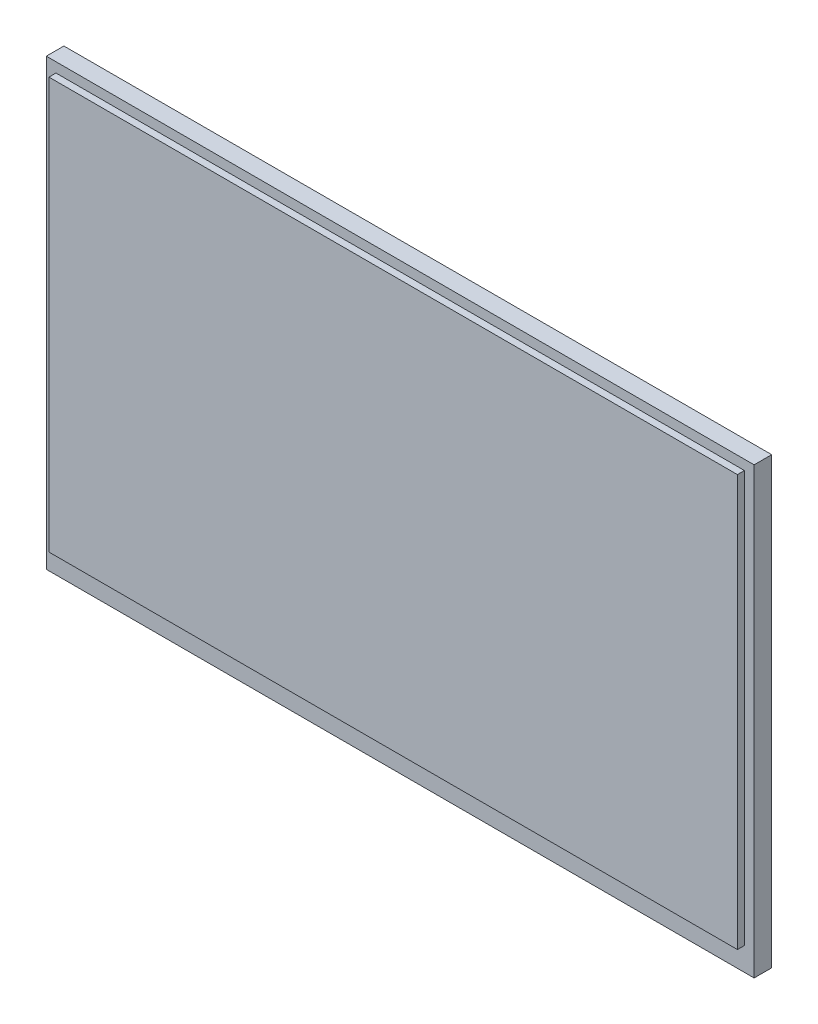
ISO-10303-21;
HEADER;
FILE_DESCRIPTION(('STEP AP214'),'2;1');
FILE_NAME('part.step','',(''),(''),'','','');
FILE_SCHEMA(('AUTOMOTIVE_DESIGN { 1 0 10303 214 1 1 1 1 }'));
ENDSEC;
DATA;
#1=APPLICATION_CONTEXT('core data for automotive mechanical design processes');
#2=APPLICATION_PROTOCOL_DEFINITION('international standard','automotive_design',2000,#1);
#3=PRODUCT_CONTEXT('',#1,'mechanical');
#4=PRODUCT('Part','Part','',(#3));
#5=PRODUCT_RELATED_PRODUCT_CATEGORY('part','',(#4));
#6=PRODUCT_DEFINITION_FORMATION('','',#4);
#7=PRODUCT_DEFINITION_CONTEXT('part definition',#1,'design');
#8=PRODUCT_DEFINITION('design','',#6,#7);
#9=PRODUCT_DEFINITION_SHAPE('','',#8);
#10=(LENGTH_UNIT() NAMED_UNIT(*) SI_UNIT(.MILLI.,.METRE.));
#11=(NAMED_UNIT(*) PLANE_ANGLE_UNIT() SI_UNIT($,.RADIAN.));
#12=(NAMED_UNIT(*) SI_UNIT($,.STERADIAN.) SOLID_ANGLE_UNIT());
#13=UNCERTAINTY_MEASURE_WITH_UNIT(LENGTH_MEASURE(1.E-05),#10,'distance_accuracy_value','');
#14=(GEOMETRIC_REPRESENTATION_CONTEXT(3) GLOBAL_UNCERTAINTY_ASSIGNED_CONTEXT((#13)) GLOBAL_UNIT_ASSIGNED_CONTEXT((#10,
#11,#12)) REPRESENTATION_CONTEXT('',''));
#15=CARTESIAN_POINT('',(0.,0.,0.));
#16=DIRECTION('',(0.,0.,1.));
#17=DIRECTION('',(1.,0.,0.));
#18=AXIS2_PLACEMENT_3D('',#15,#16,#17);
#19=CARTESIAN_POINT('',(60.4,37.925,3.));
#20=DIRECTION('',(-1.,0.,0.));
#21=DIRECTION('',(0.,0.,1.));
#22=AXIS2_PLACEMENT_3D('',#19,#20,#21);
#23=PLANE('',#22);
#24=DIRECTION('',(0.,1.,0.));
#25=VECTOR('',#24,1.);
#26=CARTESIAN_POINT('',(60.4,37.925,0.));
#27=LINE('',#26,#25);
#28=CARTESIAN_POINT('',(60.4,-37.925,0.));
#29=VERTEX_POINT('',#28);
#30=CARTESIAN_POINT('',(60.4,37.925,0.));
#31=VERTEX_POINT('',#30);
#32=EDGE_CURVE('E119',#29,#31,#27,.T.);
#33=ORIENTED_EDGE('',*,*,#32,.T.);
#34=DIRECTION('',(0.,0.,-1.));
#35=VECTOR('',#34,1.);
#36=CARTESIAN_POINT('',(60.4,37.925,3.));
#37=LINE('',#36,#35);
#38=CARTESIAN_POINT('',(60.4,37.925,3.));
#39=VERTEX_POINT('',#38);
#40=EDGE_CURVE('E11',#39,#31,#37,.T.);
#41=ORIENTED_EDGE('',*,*,#40,.F.);
#42=DIRECTION('',(0.,1.,0.));
#43=VECTOR('',#42,1.);
#44=CARTESIAN_POINT('',(60.4,37.925,3.));
#45=LINE('',#44,#43);
#46=CARTESIAN_POINT('',(60.4,-37.925,3.));
#47=VERTEX_POINT('',#46);
#48=EDGE_CURVE('E128',#47,#39,#45,.T.);
#49=ORIENTED_EDGE('',*,*,#48,.F.);
#50=DIRECTION('',(0.,0.,-1.));
#51=VECTOR('',#50,1.);
#52=CARTESIAN_POINT('',(60.4,-37.925,3.));
#53=LINE('',#52,#51);
#54=EDGE_CURVE('E137',#47,#29,#53,.T.);
#55=ORIENTED_EDGE('',*,*,#54,.T.);
#56=EDGE_LOOP('',(#33,#41,#49,#55));
#57=FACE_BOUND('',#56,.T.);
#58=ADVANCED_FACE('F35',(#57),#23,.F.);
#59=CARTESIAN_POINT('',(-60.4,37.925,3.));
#60=DIRECTION('',(0.,-1.,0.));
#61=DIRECTION('',(1.,0.,0.));
#62=AXIS2_PLACEMENT_3D('',#59,#60,#61);
#63=PLANE('',#62);
#64=DIRECTION('',(-1.,0.,0.));
#65=VECTOR('',#64,1.);
#66=CARTESIAN_POINT('',(-60.4,37.925,0.));
#67=LINE('',#66,#65);
#68=CARTESIAN_POINT('',(-60.4,37.925,0.));
#69=VERTEX_POINT('',#68);
#70=EDGE_CURVE('E122',#31,#69,#67,.T.);
#71=ORIENTED_EDGE('',*,*,#70,.T.);
#72=DIRECTION('',(0.,0.,-1.));
#73=VECTOR('',#72,1.);
#74=CARTESIAN_POINT('',(-60.4,37.925,3.));
#75=LINE('',#74,#73);
#76=CARTESIAN_POINT('',(-60.4,37.925,3.));
#77=VERTEX_POINT('',#76);
#78=EDGE_CURVE('E42',#77,#69,#75,.T.);
#79=ORIENTED_EDGE('',*,*,#78,.F.);
#80=DIRECTION('',(-1.,0.,0.));
#81=VECTOR('',#80,1.);
#82=CARTESIAN_POINT('',(-60.4,37.925,3.));
#83=LINE('',#82,#81);
#84=EDGE_CURVE('E131',#39,#77,#83,.T.);
#85=ORIENTED_EDGE('',*,*,#84,.F.);
#86=ORIENTED_EDGE('',*,*,#40,.T.);
#87=EDGE_LOOP('',(#71,#79,#85,#86));
#88=FACE_BOUND('',#87,.T.);
#89=ADVANCED_FACE('F168',(#88),#63,.F.);
#90=CARTESIAN_POINT('',(-60.4,37.925,3.));
#91=DIRECTION('',(1.,0.,0.));
#92=DIRECTION('',(0.,0.,-1.));
#93=AXIS2_PLACEMENT_3D('',#90,#91,#92);
#94=PLANE('',#93);
#95=DIRECTION('',(0.,-1.,0.));
#96=VECTOR('',#95,1.);
#97=CARTESIAN_POINT('',(-60.4,37.925,0.));
#98=LINE('',#97,#96);
#99=CARTESIAN_POINT('',(-60.4,-37.925,0.));
#100=VERTEX_POINT('',#99);
#101=EDGE_CURVE('E140',#69,#100,#98,.T.);
#102=ORIENTED_EDGE('',*,*,#101,.T.);
#103=DIRECTION('',(0.,0.,-1.));
#104=VECTOR('',#103,1.);
#105=CARTESIAN_POINT('',(-60.4,-37.925,3.));
#106=LINE('',#105,#104);
#107=CARTESIAN_POINT('',(-60.4,-37.925,3.));
#108=VERTEX_POINT('',#107);
#109=EDGE_CURVE('E145',#108,#100,#106,.T.);
#110=ORIENTED_EDGE('',*,*,#109,.F.);
#111=DIRECTION('',(0.,-1.,0.));
#112=VECTOR('',#111,1.);
#113=CARTESIAN_POINT('',(-60.4,37.925,3.));
#114=LINE('',#113,#112);
#115=EDGE_CURVE('E134',#77,#108,#114,.T.);
#116=ORIENTED_EDGE('',*,*,#115,.F.);
#117=ORIENTED_EDGE('',*,*,#78,.T.);
#118=EDGE_LOOP('',(#102,#110,#116,#117));
#119=FACE_BOUND('',#118,.T.);
#120=ADVANCED_FACE('F152',(#119),#94,.F.);
#121=CARTESIAN_POINT('',(-60.4,-37.925,3.));
#122=DIRECTION('',(0.,1.,0.));
#123=DIRECTION('',(-1.,0.,0.));
#124=AXIS2_PLACEMENT_3D('',#121,#122,#123);
#125=PLANE('',#124);
#126=DIRECTION('',(1.,0.,0.));
#127=VECTOR('',#126,1.);
#128=CARTESIAN_POINT('',(-60.4,-37.925,0.));
#129=LINE('',#128,#127);
#130=EDGE_CURVE('E132',#100,#29,#129,.T.);
#131=ORIENTED_EDGE('',*,*,#130,.T.);
#132=ORIENTED_EDGE('',*,*,#54,.F.);
#133=DIRECTION('',(1.,0.,0.));
#134=VECTOR('',#133,1.);
#135=CARTESIAN_POINT('',(-60.4,-37.925,3.));
#136=LINE('',#135,#134);
#137=EDGE_CURVE('E136',#108,#47,#136,.T.);
#138=ORIENTED_EDGE('',*,*,#137,.F.);
#139=ORIENTED_EDGE('',*,*,#109,.T.);
#140=EDGE_LOOP('',(#131,#132,#138,#139));
#141=FACE_BOUND('',#140,.T.);
#142=ADVANCED_FACE('F161',(#141),#125,.F.);
#143=CARTESIAN_POINT('',(0.,0.,3.));
#144=DIRECTION('',(0.,0.,1.));
#145=DIRECTION('',(1.,0.,0.));
#146=AXIS2_PLACEMENT_3D('',#143,#144,#145);
#147=PLANE('',#146);
#148=DIRECTION('',(0.,-1.,0.));
#149=VECTOR('',#148,1.);
#150=CARTESIAN_POINT('',(-58.75,36.255,3.));
#151=LINE('',#150,#149);
#152=CARTESIAN_POINT('',(-58.75,36.255,3.));
#153=VERTEX_POINT('',#152);
#154=CARTESIAN_POINT('',(-58.75,-33.945,3.));
#155=VERTEX_POINT('',#154);
#156=EDGE_CURVE('E49',#153,#155,#151,.T.);
#157=ORIENTED_EDGE('',*,*,#156,.F.);
#158=DIRECTION('',(-1.,0.,0.));
#159=VECTOR('',#158,1.);
#160=CARTESIAN_POINT('',(58.75,36.255,3.));
#161=LINE('',#160,#159);
#162=CARTESIAN_POINT('',(58.75,36.255,3.));
#163=VERTEX_POINT('',#162);
#164=EDGE_CURVE('E53',#163,#153,#161,.T.);
#165=ORIENTED_EDGE('',*,*,#164,.F.);
#166=DIRECTION('',(0.,1.,0.));
#167=VECTOR('',#166,1.);
#168=CARTESIAN_POINT('',(58.75,36.255,3.));
#169=LINE('',#168,#167);
#170=CARTESIAN_POINT('',(58.75,-33.945,3.));
#171=VERTEX_POINT('',#170);
#172=EDGE_CURVE('E262',#171,#163,#169,.T.);
#173=ORIENTED_EDGE('',*,*,#172,.F.);
#174=DIRECTION('',(1.,0.,0.));
#175=VECTOR('',#174,1.);
#176=CARTESIAN_POINT('',(58.75,-33.945,3.));
#177=LINE('',#176,#175);
#178=EDGE_CURVE('E268',#155,#171,#177,.T.);
#179=ORIENTED_EDGE('',*,*,#178,.F.);
#180=EDGE_LOOP('',(#157,#165,#173,#179));
#181=FACE_BOUND('',#180,.T.);
#182=ORIENTED_EDGE('',*,*,#48,.T.);
#183=ORIENTED_EDGE('',*,*,#84,.T.);
#184=ORIENTED_EDGE('',*,*,#115,.T.);
#185=ORIENTED_EDGE('',*,*,#137,.T.);
#186=EDGE_LOOP('',(#182,#183,#184,#185));
#187=FACE_BOUND('',#186,.T.);
#188=ADVANCED_FACE('F167',(#181,#187),#147,.T.);
#189=CARTESIAN_POINT('',(0.,0.,0.));
#190=DIRECTION('',(0.,0.,1.));
#191=DIRECTION('',(1.,0.,0.));
#192=AXIS2_PLACEMENT_3D('',#189,#190,#191);
#193=PLANE('',#192);
#194=ORIENTED_EDGE('',*,*,#32,.F.);
#195=ORIENTED_EDGE('',*,*,#130,.F.);
#196=ORIENTED_EDGE('',*,*,#101,.F.);
#197=ORIENTED_EDGE('',*,*,#70,.F.);
#198=EDGE_LOOP('',(#194,#195,#196,#197));
#199=FACE_BOUND('',#198,.T.);
#200=ADVANCED_FACE('F158',(#199),#193,.F.);
#201=CARTESIAN_POINT('',(-58.75,36.255,4.2));
#202=DIRECTION('',(1.,0.,0.));
#203=DIRECTION('',(0.,1.,0.));
#204=AXIS2_PLACEMENT_3D('',#201,#202,#203);
#205=PLANE('',#204);
#206=ORIENTED_EDGE('',*,*,#156,.T.);
#207=DIRECTION('',(0.,0.,-1.));
#208=VECTOR('',#207,1.);
#209=CARTESIAN_POINT('',(-58.75,-33.945,4.2));
#210=LINE('',#209,#208);
#211=CARTESIAN_POINT('',(-58.75,-33.945,4.2));
#212=VERTEX_POINT('',#211);
#213=EDGE_CURVE('E102',#212,#155,#210,.T.);
#214=ORIENTED_EDGE('',*,*,#213,.F.);
#215=DIRECTION('',(0.,-1.,0.));
#216=VECTOR('',#215,1.);
#217=CARTESIAN_POINT('',(-58.75,36.255,4.2));
#218=LINE('',#217,#216);
#219=CARTESIAN_POINT('',(-58.75,36.255,4.2));
#220=VERTEX_POINT('',#219);
#221=EDGE_CURVE('E108',#220,#212,#218,.T.);
#222=ORIENTED_EDGE('',*,*,#221,.F.);
#223=DIRECTION('',(0.,0.,-1.));
#224=VECTOR('',#223,1.);
#225=CARTESIAN_POINT('',(-58.75,36.255,4.2));
#226=LINE('',#225,#224);
#227=EDGE_CURVE('E260',#220,#153,#226,.T.);
#228=ORIENTED_EDGE('',*,*,#227,.T.);
#229=EDGE_LOOP('',(#206,#214,#222,#228));
#230=FACE_BOUND('',#229,.T.);
#231=ADVANCED_FACE('F118',(#230),#205,.F.);
#232=CARTESIAN_POINT('',(58.75,-33.945,4.2));
#233=DIRECTION('',(0.,1.,0.));
#234=DIRECTION('',(-1.,0.,0.));
#235=AXIS2_PLACEMENT_3D('',#232,#233,#234);
#236=PLANE('',#235);
#237=ORIENTED_EDGE('',*,*,#178,.T.);
#238=DIRECTION('',(0.,0.,-1.));
#239=VECTOR('',#238,1.);
#240=CARTESIAN_POINT('',(58.75,-33.945,4.2));
#241=LINE('',#240,#239);
#242=CARTESIAN_POINT('',(58.75,-33.945,4.2));
#243=VERTEX_POINT('',#242);
#244=EDGE_CURVE('E104',#243,#171,#241,.T.);
#245=ORIENTED_EDGE('',*,*,#244,.F.);
#246=DIRECTION('',(1.,0.,0.));
#247=VECTOR('',#246,1.);
#248=CARTESIAN_POINT('',(58.75,-33.945,4.2));
#249=LINE('',#248,#247);
#250=EDGE_CURVE('E97',#212,#243,#249,.T.);
#251=ORIENTED_EDGE('',*,*,#250,.F.);
#252=ORIENTED_EDGE('',*,*,#213,.T.);
#253=EDGE_LOOP('',(#237,#245,#251,#252));
#254=FACE_BOUND('',#253,.T.);
#255=ADVANCED_FACE('F100',(#254),#236,.F.);
#256=CARTESIAN_POINT('',(58.75,36.255,4.2));
#257=DIRECTION('',(-1.,0.,0.));
#258=DIRECTION('',(0.,-1.,0.));
#259=AXIS2_PLACEMENT_3D('',#256,#257,#258);
#260=PLANE('',#259);
#261=ORIENTED_EDGE('',*,*,#172,.T.);
#262=DIRECTION('',(0.,0.,-1.));
#263=VECTOR('',#262,1.);
#264=CARTESIAN_POINT('',(58.75,36.255,4.2));
#265=LINE('',#264,#263);
#266=CARTESIAN_POINT('',(58.75,36.255,4.2));
#267=VERTEX_POINT('',#266);
#268=EDGE_CURVE('E124',#267,#163,#265,.T.);
#269=ORIENTED_EDGE('',*,*,#268,.F.);
#270=DIRECTION('',(0.,1.,0.));
#271=VECTOR('',#270,1.);
#272=CARTESIAN_POINT('',(58.75,36.255,4.2));
#273=LINE('',#272,#271);
#274=EDGE_CURVE('E107',#243,#267,#273,.T.);
#275=ORIENTED_EDGE('',*,*,#274,.F.);
#276=ORIENTED_EDGE('',*,*,#244,.T.);
#277=EDGE_LOOP('',(#261,#269,#275,#276));
#278=FACE_BOUND('',#277,.T.);
#279=ADVANCED_FACE('F186',(#278),#260,.F.);
#280=CARTESIAN_POINT('',(58.75,36.255,4.2));
#281=DIRECTION('',(0.,-1.,0.));
#282=DIRECTION('',(1.,0.,0.));
#283=AXIS2_PLACEMENT_3D('',#280,#281,#282);
#284=PLANE('',#283);
#285=ORIENTED_EDGE('',*,*,#164,.T.);
#286=ORIENTED_EDGE('',*,*,#227,.F.);
#287=DIRECTION('',(-1.,0.,0.));
#288=VECTOR('',#287,1.);
#289=CARTESIAN_POINT('',(58.75,36.255,4.2));
#290=LINE('',#289,#288);
#291=EDGE_CURVE('E113',#267,#220,#290,.T.);
#292=ORIENTED_EDGE('',*,*,#291,.F.);
#293=ORIENTED_EDGE('',*,*,#268,.T.);
#294=EDGE_LOOP('',(#285,#286,#292,#293));
#295=FACE_BOUND('',#294,.T.);
#296=ADVANCED_FACE('F189',(#295),#284,.F.);
#297=CARTESIAN_POINT('',(0.,0.,4.2));
#298=DIRECTION('',(0.,0.,-1.));
#299=DIRECTION('',(-1.,0.,0.));
#300=AXIS2_PLACEMENT_3D('',#297,#298,#299);
#301=PLANE('',#300);
#302=ORIENTED_EDGE('',*,*,#221,.T.);
#303=ORIENTED_EDGE('',*,*,#250,.T.);
#304=ORIENTED_EDGE('',*,*,#274,.T.);
#305=ORIENTED_EDGE('',*,*,#291,.T.);
#306=EDGE_LOOP('',(#302,#303,#304,#305));
#307=FACE_BOUND('',#306,.T.);
#308=ADVANCED_FACE('F111',(#307),#301,.F.);
#309=CLOSED_SHELL('',(#58,#89,#120,#142,#188,#200,#231,#255,#279,#296,#308));
#310=MANIFOLD_SOLID_BREP('B2',#309);
#311=ADVANCED_BREP_SHAPE_REPRESENTATION('',(#18,#310),#14);
#312=SHAPE_DEFINITION_REPRESENTATION(#9,#311);
ENDSEC;
END-ISO-10303-21;
